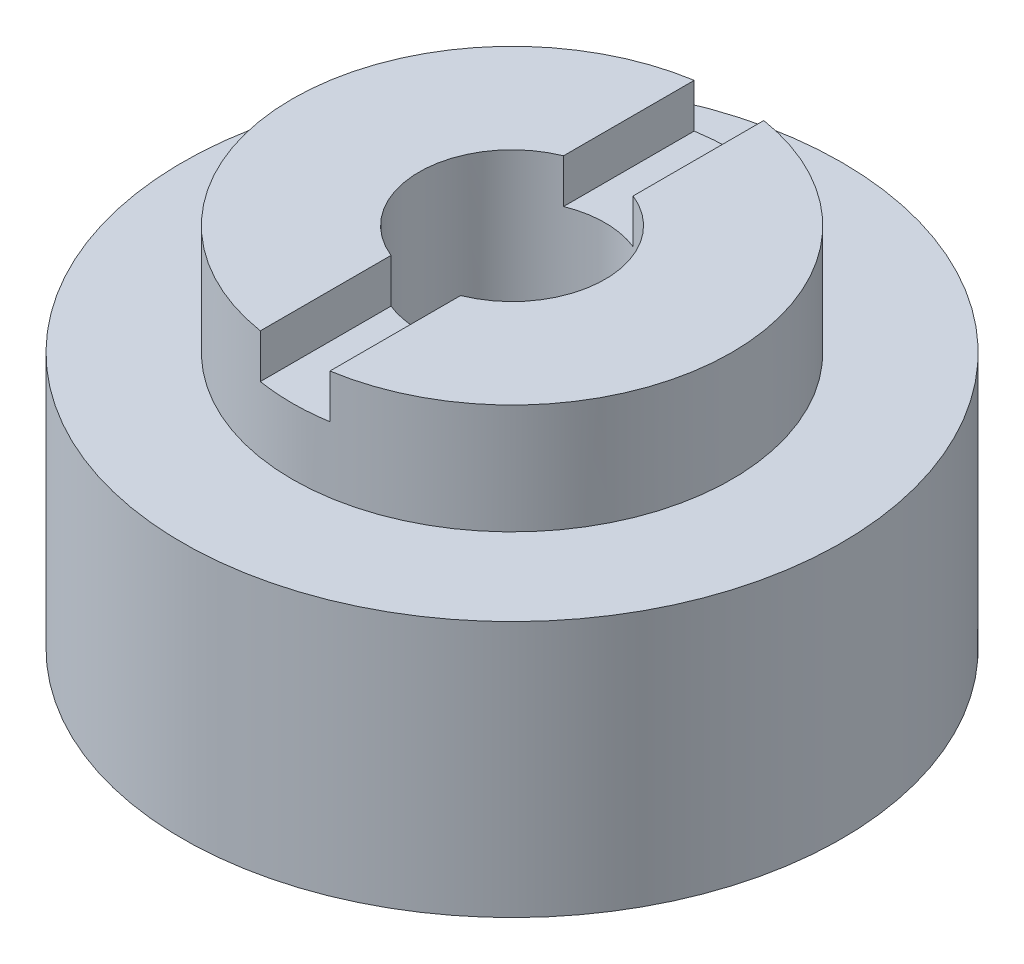
ISO-10303-21;
HEADER;
FILE_DESCRIPTION(('STEP AP214'),'2;1');
FILE_NAME('part.step','',(''),(''),'','','');
FILE_SCHEMA(('AUTOMOTIVE_DESIGN { 1 0 10303 214 1 1 1 1 }'));
ENDSEC;
DATA;
#1=APPLICATION_CONTEXT('core data for automotive mechanical design processes');
#2=APPLICATION_PROTOCOL_DEFINITION('international standard','automotive_design',2000,#1);
#3=PRODUCT_CONTEXT('',#1,'mechanical');
#4=PRODUCT('Part','Part','',(#3));
#5=PRODUCT_RELATED_PRODUCT_CATEGORY('part','',(#4));
#6=PRODUCT_DEFINITION_FORMATION('','',#4);
#7=PRODUCT_DEFINITION_CONTEXT('part definition',#1,'design');
#8=PRODUCT_DEFINITION('design','',#6,#7);
#9=PRODUCT_DEFINITION_SHAPE('','',#8);
#10=(LENGTH_UNIT() NAMED_UNIT(*) SI_UNIT(.MILLI.,.METRE.));
#11=(NAMED_UNIT(*) PLANE_ANGLE_UNIT() SI_UNIT($,.RADIAN.));
#12=(NAMED_UNIT(*) SI_UNIT($,.STERADIAN.) SOLID_ANGLE_UNIT());
#13=UNCERTAINTY_MEASURE_WITH_UNIT(LENGTH_MEASURE(1.E-05),#10,'distance_accuracy_value','');
#14=(GEOMETRIC_REPRESENTATION_CONTEXT(3) GLOBAL_UNCERTAINTY_ASSIGNED_CONTEXT((#13)) GLOBAL_UNIT_ASSIGNED_CONTEXT((#10,
#11,#12)) REPRESENTATION_CONTEXT('',''));
#15=CARTESIAN_POINT('',(0.,0.,0.));
#16=DIRECTION('',(0.,0.,1.));
#17=DIRECTION('',(1.,0.,0.));
#18=AXIS2_PLACEMENT_3D('',#15,#16,#17);
#19=CARTESIAN_POINT('',(0.,25.,0.));
#20=DIRECTION('',(0.,1.,0.));
#21=DIRECTION('',(0.,0.,1.));
#22=AXIS2_PLACEMENT_3D('',#19,#20,#21);
#23=PLANE('',#22);
#24=CARTESIAN_POINT('',(0.,25.,0.));
#25=DIRECTION('',(0.,1.,0.));
#26=DIRECTION('',(0.,0.,1.));
#27=AXIS2_PLACEMENT_3D('',#24,#25,#26);
#28=CIRCLE('',#27,12.7);
#29=CARTESIAN_POINT('',(0.,25.,12.7));
#30=VERTEX_POINT('',#29);
#31=EDGE_CURVE('E158',#30,#30,#28,.T.);
#32=ORIENTED_EDGE('',*,*,#31,.T.);
#33=EDGE_LOOP('',(#32));
#34=FACE_BOUND('',#33,.T.);
#35=CARTESIAN_POINT('',(0.,25.,0.));
#36=DIRECTION('',(0.,1.,0.));
#37=DIRECTION('',(0.,0.,1.));
#38=AXIS2_PLACEMENT_3D('',#35,#36,#37);
#39=CIRCLE('',#38,6.5);
#40=CARTESIAN_POINT('',(0.,25.,6.5));
#41=VERTEX_POINT('',#40);
#42=EDGE_CURVE('E19',#41,#41,#39,.F.);
#43=ORIENTED_EDGE('',*,*,#42,.T.);
#44=EDGE_LOOP('',(#43));
#45=FACE_BOUND('',#44,.T.);
#46=ADVANCED_FACE('F16',(#34,#45),#23,.T.);
#47=CARTESIAN_POINT('',(0.,0.,0.));
#48=DIRECTION('',(0.,1.,0.));
#49=DIRECTION('',(0.,0.,1.));
#50=AXIS2_PLACEMENT_3D('',#47,#48,#49);
#51=CYLINDRICAL_SURFACE('',#50,6.5);
#52=CARTESIAN_POINT('',(0.,19.,0.));
#53=DIRECTION('',(0.,1.,0.));
#54=DIRECTION('',(0.,0.,1.));
#55=AXIS2_PLACEMENT_3D('',#52,#53,#54);
#56=CIRCLE('',#55,6.5);
#57=CARTESIAN_POINT('',(0.,19.,6.5));
#58=VERTEX_POINT('',#57);
#59=EDGE_CURVE('E125',#58,#58,#56,.T.);
#60=ORIENTED_EDGE('',*,*,#59,.F.);
#61=EDGE_LOOP('',(#60));
#62=FACE_BOUND('',#61,.T.);
#63=ORIENTED_EDGE('',*,*,#42,.F.);
#64=EDGE_LOOP('',(#63));
#65=FACE_BOUND('',#64,.T.);
#66=ADVANCED_FACE('F166',(#62,#65),#51,.F.);
#67=CARTESIAN_POINT('',(0.,25.,0.));
#68=DIRECTION('',(0.,1.,0.));
#69=DIRECTION('',(0.,0.,1.));
#70=AXIS2_PLACEMENT_3D('',#67,#68,#69);
#71=CYLINDRICAL_SURFACE('',#70,12.7);
#72=DIRECTION('',(0.,1.,0.));
#73=VECTOR('',#72,1.);
#74=CARTESIAN_POINT('',(-4.75,44.,11.7782638788575));
#75=LINE('',#74,#73);
#76=CARTESIAN_POINT('',(-4.75,50.,11.7782638788575));
#77=VERTEX_POINT('',#76);
#78=CARTESIAN_POINT('',(-4.75,44.,11.7782638788575));
#79=VERTEX_POINT('',#78);
#80=EDGE_CURVE('E126',#77,#79,#75,.F.);
#81=ORIENTED_EDGE('',*,*,#80,.T.);
#82=CARTESIAN_POINT('',(0.,44.,0.));
#83=DIRECTION('',(0.,1.,0.));
#84=DIRECTION('',(0.,0.,1.));
#85=AXIS2_PLACEMENT_3D('',#82,#83,#84);
#86=CIRCLE('',#85,12.7);
#87=CARTESIAN_POINT('',(4.75,44.,11.7782638788575));
#88=VERTEX_POINT('',#87);
#89=EDGE_CURVE('E91',#79,#88,#86,.T.);
#90=ORIENTED_EDGE('',*,*,#89,.T.);
#91=DIRECTION('',(0.,1.,0.));
#92=VECTOR('',#91,1.);
#93=CARTESIAN_POINT('',(4.75,44.,11.7782638788575));
#94=LINE('',#93,#92);
#95=CARTESIAN_POINT('',(4.75,50.,11.7782638788575));
#96=VERTEX_POINT('',#95);
#97=EDGE_CURVE('E84',#88,#96,#94,.T.);
#98=ORIENTED_EDGE('',*,*,#97,.T.);
#99=CARTESIAN_POINT('',(0.,50.,0.));
#100=DIRECTION('',(0.,1.,0.));
#101=DIRECTION('',(0.,0.,1.));
#102=AXIS2_PLACEMENT_3D('',#99,#100,#101);
#103=CIRCLE('',#102,12.7);
#104=CARTESIAN_POINT('',(4.75,50.,-11.7782638788575));
#105=VERTEX_POINT('',#104);
#106=EDGE_CURVE('E89',#105,#96,#103,.F.);
#107=ORIENTED_EDGE('',*,*,#106,.F.);
#108=DIRECTION('',(0.,1.,0.));
#109=VECTOR('',#108,1.);
#110=CARTESIAN_POINT('',(4.75,44.,-11.7782638788575));
#111=LINE('',#110,#109);
#112=CARTESIAN_POINT('',(4.75,44.,-11.7782638788575));
#113=VERTEX_POINT('',#112);
#114=EDGE_CURVE('E79',#105,#113,#111,.F.);
#115=ORIENTED_EDGE('',*,*,#114,.T.);
#116=CARTESIAN_POINT('',(0.,44.,0.));
#117=DIRECTION('',(0.,1.,0.));
#118=DIRECTION('',(0.,0.,1.));
#119=AXIS2_PLACEMENT_3D('',#116,#117,#118);
#120=CIRCLE('',#119,12.7);
#121=CARTESIAN_POINT('',(-4.75,44.,-11.7782638788575));
#122=VERTEX_POINT('',#121);
#123=EDGE_CURVE('E151',#113,#122,#120,.T.);
#124=ORIENTED_EDGE('',*,*,#123,.T.);
#125=DIRECTION('',(0.,1.,0.));
#126=VECTOR('',#125,1.);
#127=CARTESIAN_POINT('',(-4.75,44.,-11.7782638788575));
#128=LINE('',#127,#126);
#129=CARTESIAN_POINT('',(-4.75,50.,-11.7782638788575));
#130=VERTEX_POINT('',#129);
#131=EDGE_CURVE('E120',#122,#130,#128,.T.);
#132=ORIENTED_EDGE('',*,*,#131,.T.);
#133=CARTESIAN_POINT('',(0.,50.,0.));
#134=DIRECTION('',(0.,1.,0.));
#135=DIRECTION('',(0.,0.,1.));
#136=AXIS2_PLACEMENT_3D('',#133,#134,#135);
#137=CIRCLE('',#136,12.7);
#138=EDGE_CURVE('E123',#77,#130,#137,.F.);
#139=ORIENTED_EDGE('',*,*,#138,.F.);
#140=EDGE_LOOP('',(#81,#90,#98,#107,#115,#124,#132,#139));
#141=FACE_BOUND('',#140,.T.);
#142=ORIENTED_EDGE('',*,*,#31,.F.);
#143=EDGE_LOOP('',(#142));
#144=FACE_BOUND('',#143,.T.);
#145=ADVANCED_FACE('F87',(#141,#144),#71,.F.);
#146=CARTESIAN_POINT('',(0.,19.,0.));
#147=DIRECTION('',(0.,-1.,0.));
#148=DIRECTION('',(0.,0.,-1.));
#149=AXIS2_PLACEMENT_3D('',#146,#147,#148);
#150=PLANE('',#149);
#151=CARTESIAN_POINT('',(0.,19.,0.));
#152=DIRECTION('',(0.,-1.,0.));
#153=DIRECTION('',(0.,0.,-1.));
#154=AXIS2_PLACEMENT_3D('',#151,#152,#153);
#155=CIRCLE('',#154,10.);
#156=CARTESIAN_POINT('',(0.,19.,-10.));
#157=VERTEX_POINT('',#156);
#158=EDGE_CURVE('E119',#157,#157,#155,.T.);
#159=ORIENTED_EDGE('',*,*,#158,.T.);
#160=EDGE_LOOP('',(#159));
#161=FACE_BOUND('',#160,.T.);
#162=ORIENTED_EDGE('',*,*,#59,.T.);
#163=EDGE_LOOP('',(#162));
#164=FACE_BOUND('',#163,.T.);
#165=ADVANCED_FACE('F175',(#161,#164),#150,.T.);
#166=CARTESIAN_POINT('',(4.75,44.,50.));
#167=DIRECTION('',(1.,0.,0.));
#168=DIRECTION('',(0.,0.,-1.));
#169=AXIS2_PLACEMENT_3D('',#166,#167,#168);
#170=PLANE('',#169);
#171=DIRECTION('',(0.,0.,-1.));
#172=VECTOR('',#171,1.);
#173=CARTESIAN_POINT('',(4.75,44.,0.));
#174=LINE('',#173,#172);
#175=CARTESIAN_POINT('',(4.75,44.,-29.6215715315714));
#176=VERTEX_POINT('',#175);
#177=EDGE_CURVE('E153',#176,#113,#174,.F.);
#178=ORIENTED_EDGE('',*,*,#177,.T.);
#179=ORIENTED_EDGE('',*,*,#114,.F.);
#180=DIRECTION('',(0.,0.,1.));
#181=VECTOR('',#180,1.);
#182=CARTESIAN_POINT('',(4.75,50.,0.));
#183=LINE('',#182,#181);
#184=CARTESIAN_POINT('',(4.75,50.,-29.6215715315714));
#185=VERTEX_POINT('',#184);
#186=EDGE_CURVE('E102',#185,#105,#183,.T.);
#187=ORIENTED_EDGE('',*,*,#186,.F.);
#188=DIRECTION('',(0.,1.,0.));
#189=VECTOR('',#188,1.);
#190=CARTESIAN_POINT('',(4.75,35.,-29.6215715315714));
#191=LINE('',#190,#189);
#192=EDGE_CURVE('E115',#176,#185,#191,.T.);
#193=ORIENTED_EDGE('',*,*,#192,.F.);
#194=EDGE_LOOP('',(#178,#179,#187,#193));
#195=FACE_BOUND('',#194,.T.);
#196=ADVANCED_FACE('F230',(#195),#170,.F.);
#197=CARTESIAN_POINT('',(0.,50.,0.));
#198=DIRECTION('',(0.,1.,0.));
#199=DIRECTION('',(0.,0.,1.));
#200=AXIS2_PLACEMENT_3D('',#197,#198,#199);
#201=PLANE('',#200);
#202=ORIENTED_EDGE('',*,*,#186,.T.);
#203=ORIENTED_EDGE('',*,*,#106,.T.);
#204=DIRECTION('',(0.,0.,-1.));
#205=VECTOR('',#204,1.);
#206=CARTESIAN_POINT('',(4.75,50.,50.));
#207=LINE('',#206,#205);
#208=CARTESIAN_POINT('',(4.75,50.,29.6215715315714));
#209=VERTEX_POINT('',#208);
#210=EDGE_CURVE('E96',#96,#209,#207,.F.);
#211=ORIENTED_EDGE('',*,*,#210,.T.);
#212=CARTESIAN_POINT('',(0.,50.,0.));
#213=DIRECTION('',(0.,1.,0.));
#214=DIRECTION('',(0.,0.,1.));
#215=AXIS2_PLACEMENT_3D('',#212,#213,#214);
#216=CIRCLE('',#215,30.);
#217=EDGE_CURVE('E118',#185,#209,#216,.F.);
#218=ORIENTED_EDGE('',*,*,#217,.F.);
#219=EDGE_LOOP('',(#202,#203,#211,#218));
#220=FACE_BOUND('',#219,.T.);
#221=ADVANCED_FACE('F99',(#220),#201,.T.);
#222=CARTESIAN_POINT('',(4.75,44.,50.));
#223=DIRECTION('',(1.,0.,0.));
#224=DIRECTION('',(0.,0.,-1.));
#225=AXIS2_PLACEMENT_3D('',#222,#223,#224);
#226=PLANE('',#225);
#227=ORIENTED_EDGE('',*,*,#210,.F.);
#228=ORIENTED_EDGE('',*,*,#97,.F.);
#229=DIRECTION('',(0.,0.,-1.));
#230=VECTOR('',#229,1.);
#231=CARTESIAN_POINT('',(4.75,44.,0.));
#232=LINE('',#231,#230);
#233=CARTESIAN_POINT('',(4.75,44.,29.6215715315714));
#234=VERTEX_POINT('',#233);
#235=EDGE_CURVE('E109',#88,#234,#232,.F.);
#236=ORIENTED_EDGE('',*,*,#235,.T.);
#237=DIRECTION('',(0.,1.,0.));
#238=VECTOR('',#237,1.);
#239=CARTESIAN_POINT('',(4.75,35.,29.6215715315714));
#240=LINE('',#239,#238);
#241=EDGE_CURVE('E106',#209,#234,#240,.F.);
#242=ORIENTED_EDGE('',*,*,#241,.F.);
#243=EDGE_LOOP('',(#227,#228,#236,#242));
#244=FACE_BOUND('',#243,.T.);
#245=ADVANCED_FACE('F104',(#244),#226,.F.);
#246=CARTESIAN_POINT('',(0.,44.,0.));
#247=DIRECTION('',(0.,-1.,0.));
#248=DIRECTION('',(0.,0.,-1.));
#249=AXIS2_PLACEMENT_3D('',#246,#247,#248);
#250=PLANE('',#249);
#251=CARTESIAN_POINT('',(0.,44.,0.));
#252=DIRECTION('',(0.,1.,0.));
#253=DIRECTION('',(0.,0.,1.));
#254=AXIS2_PLACEMENT_3D('',#251,#252,#253);
#255=CIRCLE('',#254,30.);
#256=CARTESIAN_POINT('',(-4.75,44.,29.6215715315714));
#257=VERTEX_POINT('',#256);
#258=EDGE_CURVE('E145',#234,#257,#255,.F.);
#259=ORIENTED_EDGE('',*,*,#258,.F.);
#260=ORIENTED_EDGE('',*,*,#235,.F.);
#261=ORIENTED_EDGE('',*,*,#89,.F.);
#262=DIRECTION('',(0.,0.,1.));
#263=VECTOR('',#262,1.);
#264=CARTESIAN_POINT('',(-4.75,44.,50.));
#265=LINE('',#264,#263);
#266=EDGE_CURVE('E127',#79,#257,#265,.T.);
#267=ORIENTED_EDGE('',*,*,#266,.T.);
#268=EDGE_LOOP('',(#259,#260,#261,#267));
#269=FACE_BOUND('',#268,.T.);
#270=ADVANCED_FACE('F221',(#269),#250,.F.);
#271=CARTESIAN_POINT('',(-4.75,44.,50.));
#272=DIRECTION('',(-1.,0.,0.));
#273=DIRECTION('',(0.,0.,1.));
#274=AXIS2_PLACEMENT_3D('',#271,#272,#273);
#275=PLANE('',#274);
#276=ORIENTED_EDGE('',*,*,#266,.F.);
#277=ORIENTED_EDGE('',*,*,#80,.F.);
#278=DIRECTION('',(0.,0.,1.));
#279=VECTOR('',#278,1.);
#280=CARTESIAN_POINT('',(-4.75,50.,0.));
#281=LINE('',#280,#279);
#282=CARTESIAN_POINT('',(-4.75,50.,29.6215715315714));
#283=VERTEX_POINT('',#282);
#284=EDGE_CURVE('E155',#283,#77,#281,.F.);
#285=ORIENTED_EDGE('',*,*,#284,.F.);
#286=DIRECTION('',(0.,1.,0.));
#287=VECTOR('',#286,1.);
#288=CARTESIAN_POINT('',(-4.75,35.,29.6215715315714));
#289=LINE('',#288,#287);
#290=EDGE_CURVE('E144',#257,#283,#289,.T.);
#291=ORIENTED_EDGE('',*,*,#290,.F.);
#292=EDGE_LOOP('',(#276,#277,#285,#291));
#293=FACE_BOUND('',#292,.T.);
#294=ADVANCED_FACE('F217',(#293),#275,.F.);
#295=CARTESIAN_POINT('',(0.,50.,0.));
#296=DIRECTION('',(0.,1.,0.));
#297=DIRECTION('',(0.,0.,1.));
#298=AXIS2_PLACEMENT_3D('',#295,#296,#297);
#299=PLANE('',#298);
#300=ORIENTED_EDGE('',*,*,#284,.T.);
#301=ORIENTED_EDGE('',*,*,#138,.T.);
#302=DIRECTION('',(0.,0.,1.));
#303=VECTOR('',#302,1.);
#304=CARTESIAN_POINT('',(-4.75,50.,50.));
#305=LINE('',#304,#303);
#306=CARTESIAN_POINT('',(-4.75,50.,-29.6215715315714));
#307=VERTEX_POINT('',#306);
#308=EDGE_CURVE('E122',#130,#307,#305,.F.);
#309=ORIENTED_EDGE('',*,*,#308,.T.);
#310=CARTESIAN_POINT('',(0.,50.,0.));
#311=DIRECTION('',(0.,1.,0.));
#312=DIRECTION('',(0.,0.,1.));
#313=AXIS2_PLACEMENT_3D('',#310,#311,#312);
#314=CIRCLE('',#313,30.);
#315=EDGE_CURVE('E141',#283,#307,#314,.F.);
#316=ORIENTED_EDGE('',*,*,#315,.F.);
#317=EDGE_LOOP('',(#300,#301,#309,#316));
#318=FACE_BOUND('',#317,.T.);
#319=ADVANCED_FACE('F214',(#318),#299,.T.);
#320=CARTESIAN_POINT('',(-4.75,44.,50.));
#321=DIRECTION('',(-1.,0.,0.));
#322=DIRECTION('',(0.,0.,1.));
#323=AXIS2_PLACEMENT_3D('',#320,#321,#322);
#324=PLANE('',#323);
#325=ORIENTED_EDGE('',*,*,#308,.F.);
#326=ORIENTED_EDGE('',*,*,#131,.F.);
#327=DIRECTION('',(0.,0.,-1.));
#328=VECTOR('',#327,1.);
#329=CARTESIAN_POINT('',(-4.75,44.,0.));
#330=LINE('',#329,#328);
#331=CARTESIAN_POINT('',(-4.75,44.,-29.6215715315714));
#332=VERTEX_POINT('',#331);
#333=EDGE_CURVE('E34',#122,#332,#330,.T.);
#334=ORIENTED_EDGE('',*,*,#333,.T.);
#335=DIRECTION('',(0.,1.,0.));
#336=VECTOR('',#335,1.);
#337=CARTESIAN_POINT('',(-4.75,35.,-29.6215715315714));
#338=LINE('',#337,#336);
#339=EDGE_CURVE('E140',#307,#332,#338,.F.);
#340=ORIENTED_EDGE('',*,*,#339,.F.);
#341=EDGE_LOOP('',(#325,#326,#334,#340));
#342=FACE_BOUND('',#341,.T.);
#343=ADVANCED_FACE('F210',(#342),#324,.F.);
#344=CARTESIAN_POINT('',(0.,44.,0.));
#345=DIRECTION('',(0.,-1.,0.));
#346=DIRECTION('',(0.,0.,-1.));
#347=AXIS2_PLACEMENT_3D('',#344,#345,#346);
#348=PLANE('',#347);
#349=CARTESIAN_POINT('',(0.,44.,0.));
#350=DIRECTION('',(0.,1.,0.));
#351=DIRECTION('',(0.,0.,1.));
#352=AXIS2_PLACEMENT_3D('',#349,#350,#351);
#353=CIRCLE('',#352,30.);
#354=EDGE_CURVE('E138',#332,#176,#353,.F.);
#355=ORIENTED_EDGE('',*,*,#354,.F.);
#356=ORIENTED_EDGE('',*,*,#333,.F.);
#357=ORIENTED_EDGE('',*,*,#123,.F.);
#358=ORIENTED_EDGE('',*,*,#177,.F.);
#359=EDGE_LOOP('',(#355,#356,#357,#358));
#360=FACE_BOUND('',#359,.T.);
#361=ADVANCED_FACE('F206',(#360),#348,.F.);
#362=CARTESIAN_POINT('',(0.,13.6602540378444,0.));
#363=DIRECTION('',(0.,-1.,0.));
#364=DIRECTION('',(0.,0.,-1.));
#365=AXIS2_PLACEMENT_3D('',#362,#363,#364);
#366=CONICAL_SURFACE('',#365,11.4307806183469,0.26179938779915);
#367=CARTESIAN_POINT('',(0.,13.6602540378444,0.));
#368=DIRECTION('',(0.,-1.,0.));
#369=DIRECTION('',(0.,0.,-1.));
#370=AXIS2_PLACEMENT_3D('',#367,#368,#369);
#371=CIRCLE('',#370,11.4307806183469);
#372=CARTESIAN_POINT('',(0.,13.6602540378444,-11.430780618347));
#373=VERTEX_POINT('',#372);
#374=EDGE_CURVE('E137',#373,#373,#371,.T.);
#375=ORIENTED_EDGE('',*,*,#374,.T.);
#376=EDGE_LOOP('',(#375));
#377=FACE_BOUND('',#376,.T.);
#378=ORIENTED_EDGE('',*,*,#158,.F.);
#379=EDGE_LOOP('',(#378));
#380=FACE_BOUND('',#379,.T.);
#381=ADVANCED_FACE('F202',(#377,#380),#366,.F.);
#382=CARTESIAN_POINT('',(0.,35.,0.));
#383=DIRECTION('',(0.,1.,0.));
#384=DIRECTION('',(0.,0.,1.));
#385=AXIS2_PLACEMENT_3D('',#382,#383,#384);
#386=CYLINDRICAL_SURFACE('',#385,30.);
#387=CARTESIAN_POINT('',(0.,35.,0.));
#388=DIRECTION('',(0.,1.,0.));
#389=DIRECTION('',(0.,0.,1.));
#390=AXIS2_PLACEMENT_3D('',#387,#388,#389);
#391=CIRCLE('',#390,30.);
#392=CARTESIAN_POINT('',(0.,35.,30.));
#393=VERTEX_POINT('',#392);
#394=EDGE_CURVE('E134',#393,#393,#391,.F.);
#395=ORIENTED_EDGE('',*,*,#394,.F.);
#396=EDGE_LOOP('',(#395));
#397=FACE_BOUND('',#396,.T.);
#398=ORIENTED_EDGE('',*,*,#339,.T.);
#399=ORIENTED_EDGE('',*,*,#354,.T.);
#400=ORIENTED_EDGE('',*,*,#192,.T.);
#401=ORIENTED_EDGE('',*,*,#217,.T.);
#402=ORIENTED_EDGE('',*,*,#241,.T.);
#403=ORIENTED_EDGE('',*,*,#258,.T.);
#404=ORIENTED_EDGE('',*,*,#290,.T.);
#405=ORIENTED_EDGE('',*,*,#315,.T.);
#406=EDGE_LOOP('',(#398,#399,#400,#401,#402,#403,#404,#405));
#407=FACE_BOUND('',#406,.T.);
#408=ADVANCED_FACE('F198',(#397,#407),#386,.T.);
#409=CARTESIAN_POINT('',(0.,0.,0.));
#410=DIRECTION('',(0.,-1.,0.));
#411=DIRECTION('',(0.,0.,-1.));
#412=AXIS2_PLACEMENT_3D('',#409,#410,#411);
#413=CONICAL_SURFACE('',#412,35.0910346561915,1.0471975511966);
#414=CARTESIAN_POINT('',(0.,0.,0.));
#415=DIRECTION('',(0.,-1.,0.));
#416=DIRECTION('',(0.,0.,-1.));
#417=AXIS2_PLACEMENT_3D('',#414,#415,#416);
#418=CIRCLE('',#417,35.0910346561914);
#419=CARTESIAN_POINT('',(0.,0.,-35.0910346561915));
#420=VERTEX_POINT('',#419);
#421=EDGE_CURVE('E131',#420,#420,#418,.T.);
#422=CARTESIAN_POINT('',(0.,0.,-35.0910346561915));
#423=CARTESIAN_POINT('',(0.,0.142294312894208,-34.8445736766306));
#424=CARTESIAN_POINT('',(0.,0.284588625788422,-34.5981126970697));
#425=CARTESIAN_POINT('',(0.,0.569177251576848,-34.105190737948));
#426=CARTESIAN_POINT('',(0.,0.711471564471061,-33.8587297583871));
#427=CARTESIAN_POINT('',(0.,0.996060190259486,-33.3658077992653));
#428=CARTESIAN_POINT('',(0.,1.1383545031537,-33.1193468197045));
#429=CARTESIAN_POINT('',(0.,1.42294312894212,-32.6264248605827));
#430=CARTESIAN_POINT('',(0.,1.56523744183634,-32.3799638810218));
#431=CARTESIAN_POINT('',(0.,1.84982606762476,-31.8870419219001));
#432=CARTESIAN_POINT('',(0.,1.99212038051897,-31.6405809423392));
#433=CARTESIAN_POINT('',(0.,2.2767090063074,-31.1476589832174));
#434=CARTESIAN_POINT('',(0.,2.41900331920161,-30.9011980036565));
#435=CARTESIAN_POINT('',(0.,2.70359194499004,-30.4082760445348));
#436=CARTESIAN_POINT('',(0.,2.84588625788425,-30.1618150649739));
#437=CARTESIAN_POINT('',(0.,3.13047488367267,-29.6688931058521));
#438=CARTESIAN_POINT('',(0.,3.27276919656689,-29.4224321262913));
#439=CARTESIAN_POINT('',(0.,3.55735782235531,-28.9295101671695));
#440=CARTESIAN_POINT('',(0.,3.69965213524952,-28.6830491876086));
#441=CARTESIAN_POINT('',(0.,3.98424076103795,-28.1901272284869));
#442=CARTESIAN_POINT('',(0.,4.12653507393216,-27.943666248926));
#443=CARTESIAN_POINT('',(0.,4.41112369972059,-27.4507442898042));
#444=CARTESIAN_POINT('',(0.,4.5534180126148,-27.2042833102433));
#445=CARTESIAN_POINT('',(0.,4.83800663840322,-26.7113613511216));
#446=CARTESIAN_POINT('',(0.,4.98030095129744,-26.4649003715607));
#447=CARTESIAN_POINT('',(0.,5.26488957708586,-25.9719784124389));
#448=CARTESIAN_POINT('',(0.,5.40718388998007,-25.7255174328781));
#449=CARTESIAN_POINT('',(0.,5.6917725157685,-25.2325954737563));
#450=CARTESIAN_POINT('',(0.,5.83406682866271,-24.9861344941954));
#451=CARTESIAN_POINT('',(0.,6.11865545445114,-24.4932125350737));
#452=CARTESIAN_POINT('',(0.,6.26094976734535,-24.2467515555128));
#453=CARTESIAN_POINT('',(0.,6.54553839313377,-23.753829596391));
#454=CARTESIAN_POINT('',(0.,6.68783270602799,-23.5073686168301));
#455=CARTESIAN_POINT('',(0.,6.97242133181641,-23.0144466577084));
#456=CARTESIAN_POINT('',(0.,7.11471564471062,-22.7679856781475));
#457=CARTESIAN_POINT('',(0.,7.39930427049905,-22.2750637190257));
#458=CARTESIAN_POINT('',(0.,7.54159858339326,-22.0286027394649));
#459=CARTESIAN_POINT('',(0.,7.82618720918169,-21.5356807803431));
#460=CARTESIAN_POINT('',(0.,7.9684815220759,-21.2892198007822));
#461=CARTESIAN_POINT('',(0.,8.25307014786432,-20.7962978416605));
#462=CARTESIAN_POINT('',(0.,8.39536446075854,-20.5498368620996));
#463=CARTESIAN_POINT('',(0.,8.67995308654696,-20.0569149029778));
#464=CARTESIAN_POINT('',(0.,8.82224739944117,-19.810453923417));
#465=CARTESIAN_POINT('',(0.,9.1068360252296,-19.3175319642952));
#466=CARTESIAN_POINT('',(0.,9.24913033812381,-19.0710709847343));
#467=CARTESIAN_POINT('',(0.,9.53371896391224,-18.5781490256126));
#468=CARTESIAN_POINT('',(0.,9.67601327680645,-18.3316880460517));
#469=CARTESIAN_POINT('',(0.,9.96060190259488,-17.8387660869299));
#470=CARTESIAN_POINT('',(0.,10.1028962154891,-17.592305107369));
#471=CARTESIAN_POINT('',(0.,10.3874848412775,-17.0993831482473));
#472=CARTESIAN_POINT('',(0.,10.5297791541717,-16.8529221686864));
#473=CARTESIAN_POINT('',(0.,10.8143677799602,-16.3600002095646));
#474=CARTESIAN_POINT('',(0.,10.9566620928544,-16.1135392300038));
#475=CARTESIAN_POINT('',(0.,11.2412507186428,-15.620617270882));
#476=CARTESIAN_POINT('',(0.,11.383545031537,-15.3741562913211));
#477=CARTESIAN_POINT('',(0.,11.6681336573254,-14.8812343321994));
#478=CARTESIAN_POINT('',(0.,11.8104279702196,-14.6347733526385));
#479=CARTESIAN_POINT('',(0.,12.0950165960081,-14.1418513935167));
#480=CARTESIAN_POINT('',(0.,12.2373109089023,-13.8953904139558));
#481=CARTESIAN_POINT('',(0.,12.5218995346907,-13.4024684548341));
#482=CARTESIAN_POINT('',(0.,12.6641938475849,-13.1560074752732));
#483=CARTESIAN_POINT('',(0.,12.9487824733733,-12.6630855161514));
#484=CARTESIAN_POINT('',(0.,13.0910767862676,-12.4166245365906));
#485=CARTESIAN_POINT('',(0.,13.375665412056,-11.9237025774688));
#486=CARTESIAN_POINT('',(0.,13.5179597249502,-11.6772415979079));
#487=CARTESIAN_POINT('',(0.,13.6602540378444,-11.430780618347));
#488=B_SPLINE_CURVE_WITH_KNOTS('',3,(#422,#423,#424,#425,#426,#427,#428,#429,#430,#431,#432,
#433,#434,#435,#436,#437,#438,#439,#440,#441,#442,#443,#444,#445,#446,#447,#448,#449,#450,#451,
#452,#453,#454,#455,#456,#457,#458,#459,#460,#461,#462,#463,#464,#465,#466,#467,#468,#469,#470,
#471,#472,#473,#474,#475,#476,#477,#478,#479,#480,#481,#482,#483,#484,#485,#486,#487),
.UNSPECIFIED.,.F.,.F.,(4,2,2,2,2,2,2,2,2,2,2,2,2,2,2,2,2,2,2,2,2,2,2,2,2,2,2,2,2,2,2,2,4),(0.,
0.853765877365279,1.70753175473055,2.56129763209583,3.4150635094611,4.26882938682638,
5.12259526419166,5.97636114155693,6.83012701892221,7.68389289628749,8.53765877365276,
9.39142465101804,10.2451905283833,11.0989564057486,11.9527222831139,12.8064881604791,
13.6602540378444,14.5140199152097,15.367785792575,16.2215516699402,17.0753175473055,
17.9290834246708,18.7828493020361,19.6366151794014,20.4903810567666,21.3441469341319,
22.1979128114972,23.0516786888625,23.9054445662277,24.759210443593,25.6129763209583,
26.4667421983236,27.3205080756889),.UNSPECIFIED.);
#489=EDGE_CURVE('BSEAM194',#420,#373,#488,.T.);
#490=ORIENTED_EDGE('',*,*,#421,.T.);
#491=ORIENTED_EDGE('',*,*,#374,.F.);
#492=ORIENTED_EDGE('',*,*,#489,.T.);
#493=ORIENTED_EDGE('',*,*,#489,.F.);
#494=EDGE_LOOP('',(#490,#492,#491,#493));
#495=FACE_BOUND('',#494,.T.);
#496=ADVANCED_FACE('F194',(#495),#413,.F.);
#497=CARTESIAN_POINT('',(0.,35.,0.));
#498=DIRECTION('',(0.,1.,0.));
#499=DIRECTION('',(0.,0.,1.));
#500=AXIS2_PLACEMENT_3D('',#497,#498,#499);
#501=PLANE('',#500);
#502=CARTESIAN_POINT('',(0.,35.,0.));
#503=DIRECTION('',(0.,-1.,0.));
#504=DIRECTION('',(0.,0.,-1.));
#505=AXIS2_PLACEMENT_3D('',#502,#503,#504);
#506=CIRCLE('',#505,45.);
#507=CARTESIAN_POINT('',(0.,35.,-45.));
#508=VERTEX_POINT('',#507);
#509=EDGE_CURVE('E25',#508,#508,#506,.T.);
#510=ORIENTED_EDGE('',*,*,#509,.F.);
#511=EDGE_LOOP('',(#510));
#512=FACE_BOUND('',#511,.T.);
#513=ORIENTED_EDGE('',*,*,#394,.T.);
#514=EDGE_LOOP('',(#513));
#515=FACE_BOUND('',#514,.T.);
#516=ADVANCED_FACE('F187',(#512,#515),#501,.T.);
#517=CARTESIAN_POINT('',(0.,0.,0.));
#518=DIRECTION('',(0.,1.,0.));
#519=DIRECTION('',(0.,0.,1.));
#520=AXIS2_PLACEMENT_3D('',#517,#518,#519);
#521=PLANE('',#520);
#522=CARTESIAN_POINT('',(0.,0.,0.));
#523=DIRECTION('',(0.,-1.,0.));
#524=DIRECTION('',(0.,0.,-1.));
#525=AXIS2_PLACEMENT_3D('',#522,#523,#524);
#526=CIRCLE('',#525,45.);
#527=CARTESIAN_POINT('',(0.,0.,-45.));
#528=VERTEX_POINT('',#527);
#529=EDGE_CURVE('E11',#528,#528,#526,.F.);
#530=ORIENTED_EDGE('',*,*,#529,.F.);
#531=EDGE_LOOP('',(#530));
#532=FACE_BOUND('',#531,.T.);
#533=ORIENTED_EDGE('',*,*,#421,.F.);
#534=EDGE_LOOP('',(#533));
#535=FACE_BOUND('',#534,.T.);
#536=ADVANCED_FACE('F180',(#532,#535),#521,.F.);
#537=CARTESIAN_POINT('',(0.,50.,0.));
#538=DIRECTION('',(0.,-1.,0.));
#539=DIRECTION('',(0.,0.,-1.));
#540=AXIS2_PLACEMENT_3D('',#537,#538,#539);
#541=CYLINDRICAL_SURFACE('',#540,45.);
#542=ORIENTED_EDGE('',*,*,#529,.T.);
#543=EDGE_LOOP('',(#542));
#544=FACE_BOUND('',#543,.T.);
#545=ORIENTED_EDGE('',*,*,#509,.T.);
#546=EDGE_LOOP('',(#545));
#547=FACE_BOUND('',#546,.T.);
#548=ADVANCED_FACE('F178',(#544,#547),#541,.T.);
#549=CLOSED_SHELL('',(#46,#66,#145,#165,#196,#221,#245,#270,#294,#319,#343,#361,#381,#408,#496,
#516,#536,#548));
#550=MANIFOLD_SOLID_BREP('B1',#549);
#551=ADVANCED_BREP_SHAPE_REPRESENTATION('',(#18,#550),#14);
#552=SHAPE_DEFINITION_REPRESENTATION(#9,#551);
ENDSEC;
END-ISO-10303-21;
